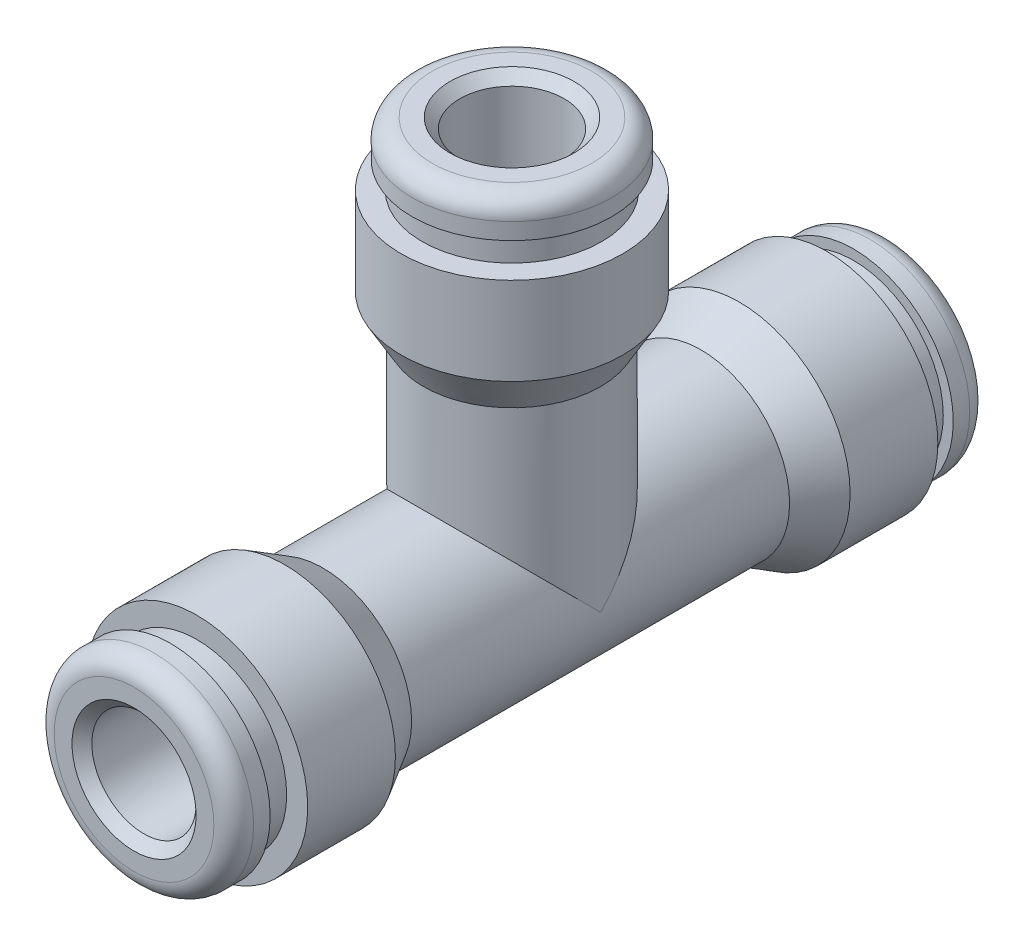
ISO-10303-21;
HEADER;
FILE_DESCRIPTION(('STEP AP214'),'2;1');
FILE_NAME('part.step','',(''),(''),'','','');
FILE_SCHEMA(('AUTOMOTIVE_DESIGN { 1 0 10303 214 1 1 1 1 }'));
ENDSEC;
DATA;
#1=APPLICATION_CONTEXT('core data for automotive mechanical design processes');
#2=APPLICATION_PROTOCOL_DEFINITION('international standard','automotive_design',2000,#1);
#3=PRODUCT_CONTEXT('',#1,'mechanical');
#4=PRODUCT('Part','Part','',(#3));
#5=PRODUCT_RELATED_PRODUCT_CATEGORY('part','',(#4));
#6=PRODUCT_DEFINITION_FORMATION('','',#4);
#7=PRODUCT_DEFINITION_CONTEXT('part definition',#1,'design');
#8=PRODUCT_DEFINITION('design','',#6,#7);
#9=PRODUCT_DEFINITION_SHAPE('','',#8);
#10=(LENGTH_UNIT() NAMED_UNIT(*) SI_UNIT(.MILLI.,.METRE.));
#11=(NAMED_UNIT(*) PLANE_ANGLE_UNIT() SI_UNIT($,.RADIAN.));
#12=(NAMED_UNIT(*) SI_UNIT($,.STERADIAN.) SOLID_ANGLE_UNIT());
#13=UNCERTAINTY_MEASURE_WITH_UNIT(LENGTH_MEASURE(1.E-05),#10,'distance_accuracy_value','');
#14=(GEOMETRIC_REPRESENTATION_CONTEXT(3) GLOBAL_UNCERTAINTY_ASSIGNED_CONTEXT((#13)) GLOBAL_UNIT_ASSIGNED_CONTEXT((#10,
#11,#12)) REPRESENTATION_CONTEXT('',''));
#15=CARTESIAN_POINT('',(0.,0.,0.));
#16=DIRECTION('',(0.,0.,1.));
#17=DIRECTION('',(1.,0.,0.));
#18=AXIS2_PLACEMENT_3D('',#15,#16,#17);
#19=CARTESIAN_POINT('',(0.,0.,0.));
#20=DIRECTION('',(0.,-1.,0.));
#21=DIRECTION('',(0.,0.,-1.));
#22=AXIS2_PLACEMENT_3D('',#19,#20,#21);
#23=CYLINDRICAL_SURFACE('',#22,1.23799999999998);
#24=CARTESIAN_POINT('',(0.,4.6,0.));
#25=DIRECTION('',(0.,-1.,0.));
#26=DIRECTION('',(1.,0.,0.));
#27=AXIS2_PLACEMENT_3D('',#24,#25,#26);
#28=CIRCLE('',#27,1.238);
#29=CARTESIAN_POINT('',(1.238,4.6,0.));
#30=VERTEX_POINT('',#29);
#31=EDGE_CURVE('E141',#30,#30,#28,.T.);
#32=ORIENTED_EDGE('',*,*,#31,.F.);
#33=EDGE_LOOP('',(#32));
#34=FACE_BOUND('',#33,.T.);
#35=CARTESIAN_POINT('',(0.,0.,0.));
#36=DIRECTION('',(0.,-0.707106781186547,0.707106781186547));
#37=DIRECTION('',(0.,-0.707106781186547,-0.707106781186547));
#38=AXIS2_PLACEMENT_3D('',#35,#36,#37);
#39=ELLIPSE('',#38,1.75079639021788,1.23799999999999);
#40=CARTESIAN_POINT('',(-1.238,0.,0.));
#41=VERTEX_POINT('',#40);
#42=CARTESIAN_POINT('',(1.238,0.,0.));
#43=VERTEX_POINT('',#42);
#44=EDGE_CURVE('E61',#41,#43,#39,.F.);
#45=ORIENTED_EDGE('',*,*,#44,.F.);
#46=CARTESIAN_POINT('',(0.,0.,0.));
#47=DIRECTION('',(0.,-0.707106781186547,-0.707106781186547));
#48=DIRECTION('',(0.,-0.707106781186547,0.707106781186547));
#49=AXIS2_PLACEMENT_3D('',#46,#47,#48);
#50=ELLIPSE('',#49,1.75079639021788,1.23799999999999);
#51=EDGE_CURVE('E65',#43,#41,#50,.F.);
#52=ORIENTED_EDGE('',*,*,#51,.F.);
#53=EDGE_LOOP('',(#45,#52));
#54=FACE_BOUND('',#53,.T.);
#55=ADVANCED_FACE('F38',(#34,#54),#23,.F.);
#56=CARTESIAN_POINT('',(0.,0.,0.));
#57=DIRECTION('',(0.,0.,1.));
#58=DIRECTION('',(1.,0.,0.));
#59=AXIS2_PLACEMENT_3D('',#56,#57,#58);
#60=CYLINDRICAL_SURFACE('',#59,1.238);
#61=ORIENTED_EDGE('',*,*,#44,.T.);
#62=ORIENTED_EDGE('',*,*,#51,.T.);
#63=EDGE_LOOP('',(#61,#62));
#64=FACE_BOUND('',#63,.T.);
#65=CARTESIAN_POINT('',(0.,0.,4.35));
#66=DIRECTION('',(0.,0.,-1.));
#67=DIRECTION('',(1.,0.,0.));
#68=AXIS2_PLACEMENT_3D('',#65,#66,#67);
#69=CIRCLE('',#68,1.238);
#70=CARTESIAN_POINT('',(1.238,0.,4.35));
#71=VERTEX_POINT('',#70);
#72=EDGE_CURVE('E103',#71,#71,#69,.T.);
#73=ORIENTED_EDGE('',*,*,#72,.F.);
#74=EDGE_LOOP('',(#73));
#75=FACE_BOUND('',#74,.T.);
#76=CARTESIAN_POINT('',(0.,0.,-4.35));
#77=DIRECTION('',(0.,0.,1.));
#78=DIRECTION('',(1.,0.,0.));
#79=AXIS2_PLACEMENT_3D('',#76,#77,#78);
#80=CIRCLE('',#79,1.238);
#81=CARTESIAN_POINT('',(1.238,0.,-4.35));
#82=VERTEX_POINT('',#81);
#83=EDGE_CURVE('E46',#82,#82,#80,.T.);
#84=ORIENTED_EDGE('',*,*,#83,.F.);
#85=EDGE_LOOP('',(#84));
#86=FACE_BOUND('',#85,.T.);
#87=ADVANCED_FACE('F63',(#64,#75,#86),#60,.F.);
#88=CARTESIAN_POINT('',(0.,0.,0.));
#89=DIRECTION('',(0.,0.,1.));
#90=DIRECTION('',(1.,0.,0.));
#91=AXIS2_PLACEMENT_3D('',#88,#89,#90);
#92=CYLINDRICAL_SURFACE('',#91,3.4);
#93=CARTESIAN_POINT('',(0.,0.,-7.25));
#94=DIRECTION('',(0.,0.,1.));
#95=DIRECTION('',(1.,0.,0.));
#96=AXIS2_PLACEMENT_3D('',#93,#94,#95);
#97=CIRCLE('',#96,3.4);
#98=CARTESIAN_POINT('',(3.4,0.,-7.25));
#99=VERTEX_POINT('',#98);
#100=EDGE_CURVE('E174',#99,#99,#97,.T.);
#101=ORIENTED_EDGE('',*,*,#100,.T.);
#102=EDGE_LOOP('',(#101));
#103=FACE_BOUND('',#102,.T.);
#104=CARTESIAN_POINT('',(0.,0.,0.));
#105=DIRECTION('',(0.,0.707106781186546,0.707106781186549));
#106=DIRECTION('',(0.,-0.707106781186549,0.707106781186546));
#107=AXIS2_PLACEMENT_3D('',#104,#105,#106);
#108=ELLIPSE('',#107,4.80832611206851,3.4);
#109=CARTESIAN_POINT('',(3.4,0.,0.));
#110=VERTEX_POINT('',#109);
#111=CARTESIAN_POINT('',(-3.4,0.,0.));
#112=VERTEX_POINT('',#111);
#113=EDGE_CURVE('E11',#110,#112,#108,.T.);
#114=ORIENTED_EDGE('',*,*,#113,.F.);
#115=CARTESIAN_POINT('',(0.,0.,0.));
#116=DIRECTION('',(0.,-0.707106781186551,0.707106781186544));
#117=DIRECTION('',(0.,-0.707106781186544,-0.707106781186551));
#118=AXIS2_PLACEMENT_3D('',#115,#116,#117);
#119=ELLIPSE('',#118,4.80832611206851,3.4);
#120=EDGE_CURVE('E106',#110,#112,#119,.T.);
#121=ORIENTED_EDGE('',*,*,#120,.T.);
#122=EDGE_LOOP('',(#114,#121));
#123=FACE_BOUND('',#122,.T.);
#124=CARTESIAN_POINT('',(0.,0.,7.25));
#125=DIRECTION('',(0.,0.,-1.));
#126=DIRECTION('',(1.,0.,0.));
#127=AXIS2_PLACEMENT_3D('',#124,#125,#126);
#128=CIRCLE('',#127,3.4);
#129=CARTESIAN_POINT('',(3.4,0.,7.25));
#130=VERTEX_POINT('',#129);
#131=EDGE_CURVE('E100',#130,#130,#128,.T.);
#132=ORIENTED_EDGE('',*,*,#131,.T.);
#133=EDGE_LOOP('',(#132));
#134=FACE_BOUND('',#133,.T.);
#135=ADVANCED_FACE('F181',(#103,#123,#134),#92,.T.);
#136=CARTESIAN_POINT('',(0.,2.,-4.35));
#137=DIRECTION('',(0.,0.,1.));
#138=DIRECTION('',(1.,0.,0.));
#139=AXIS2_PLACEMENT_3D('',#136,#137,#138);
#140=PLANE('',#139);
#141=CARTESIAN_POINT('',(0.,0.,-4.35));
#142=DIRECTION('',(0.,0.,1.));
#143=DIRECTION('',(1.,0.,0.));
#144=AXIS2_PLACEMENT_3D('',#141,#142,#143);
#145=CIRCLE('',#144,2.);
#146=CARTESIAN_POINT('',(2.,0.,-4.35));
#147=VERTEX_POINT('',#146);
#148=EDGE_CURVE('E144',#147,#147,#145,.T.);
#149=ORIENTED_EDGE('',*,*,#148,.F.);
#150=EDGE_LOOP('',(#149));
#151=FACE_BOUND('',#150,.T.);
#152=ORIENTED_EDGE('',*,*,#83,.T.);
#153=EDGE_LOOP('',(#152));
#154=FACE_BOUND('',#153,.T.);
#155=ADVANCED_FACE('F40',(#151,#154),#140,.F.);
#156=CARTESIAN_POINT('',(0.,0.,-8.72224318643354));
#157=DIRECTION('',(0.,0.,-1.));
#158=DIRECTION('',(-1.,0.,0.));
#159=AXIS2_PLACEMENT_3D('',#156,#157,#158);
#160=CONICAL_SURFACE('',#159,4.25,0.523598775598301);
#161=ORIENTED_EDGE('',*,*,#100,.F.);
#162=EDGE_LOOP('',(#161));
#163=FACE_BOUND('',#162,.T.);
#164=CARTESIAN_POINT('',(0.,0.,-8.72224318643354));
#165=DIRECTION('',(0.,0.,1.));
#166=DIRECTION('',(1.,0.,0.));
#167=AXIS2_PLACEMENT_3D('',#164,#165,#166);
#168=CIRCLE('',#167,4.25);
#169=CARTESIAN_POINT('',(4.25,0.,-8.72224318643354));
#170=VERTEX_POINT('',#169);
#171=EDGE_CURVE('E171',#170,#170,#168,.T.);
#172=ORIENTED_EDGE('',*,*,#171,.T.);
#173=EDGE_LOOP('',(#172));
#174=FACE_BOUND('',#173,.T.);
#175=ADVANCED_FACE('F191',(#163,#174),#160,.T.);
#176=CARTESIAN_POINT('',(0.,0.,0.));
#177=DIRECTION('',(0.,0.,1.));
#178=DIRECTION('',(1.,0.,0.));
#179=AXIS2_PLACEMENT_3D('',#176,#177,#178);
#180=CYLINDRICAL_SURFACE('',#179,4.25);
#181=ORIENTED_EDGE('',*,*,#171,.F.);
#182=EDGE_LOOP('',(#181));
#183=FACE_BOUND('',#182,.T.);
#184=CARTESIAN_POINT('',(0.,0.,-12.087));
#185=DIRECTION('',(0.,0.,1.));
#186=DIRECTION('',(1.,0.,0.));
#187=AXIS2_PLACEMENT_3D('',#184,#185,#186);
#188=CIRCLE('',#187,4.25);
#189=CARTESIAN_POINT('',(4.25,0.,-12.087));
#190=VERTEX_POINT('',#189);
#191=EDGE_CURVE('E168',#190,#190,#188,.T.);
#192=ORIENTED_EDGE('',*,*,#191,.T.);
#193=EDGE_LOOP('',(#192));
#194=FACE_BOUND('',#193,.T.);
#195=ADVANCED_FACE('F194',(#183,#194),#180,.T.);
#196=CARTESIAN_POINT('',(0.,4.25,-12.087));
#197=DIRECTION('',(0.,0.,1.));
#198=DIRECTION('',(1.,0.,0.));
#199=AXIS2_PLACEMENT_3D('',#196,#197,#198);
#200=PLANE('',#199);
#201=ORIENTED_EDGE('',*,*,#191,.F.);
#202=EDGE_LOOP('',(#201));
#203=FACE_BOUND('',#202,.T.);
#204=CARTESIAN_POINT('',(0.,0.,-12.087));
#205=DIRECTION('',(0.,0.,1.));
#206=DIRECTION('',(1.,0.,0.));
#207=AXIS2_PLACEMENT_3D('',#204,#205,#206);
#208=CIRCLE('',#207,3.4425);
#209=CARTESIAN_POINT('',(3.4425,0.,-12.087));
#210=VERTEX_POINT('',#209);
#211=EDGE_CURVE('E165',#210,#210,#208,.T.);
#212=ORIENTED_EDGE('',*,*,#211,.T.);
#213=EDGE_LOOP('',(#212));
#214=FACE_BOUND('',#213,.T.);
#215=ADVANCED_FACE('F198',(#203,#214),#200,.F.);
#216=CARTESIAN_POINT('',(0.,0.,0.));
#217=DIRECTION('',(0.,0.,1.));
#218=DIRECTION('',(1.,0.,0.));
#219=AXIS2_PLACEMENT_3D('',#216,#217,#218);
#220=CYLINDRICAL_SURFACE('',#219,3.4425);
#221=ORIENTED_EDGE('',*,*,#211,.F.);
#222=EDGE_LOOP('',(#221));
#223=FACE_BOUND('',#222,.T.);
#224=CARTESIAN_POINT('',(0.,0.,-13.103));
#225=DIRECTION('',(0.,0.,1.));
#226=DIRECTION('',(1.,0.,0.));
#227=AXIS2_PLACEMENT_3D('',#224,#225,#226);
#228=CIRCLE('',#227,3.4425);
#229=CARTESIAN_POINT('',(3.4425,0.,-13.103));
#230=VERTEX_POINT('',#229);
#231=EDGE_CURVE('E162',#230,#230,#228,.T.);
#232=ORIENTED_EDGE('',*,*,#231,.T.);
#233=EDGE_LOOP('',(#232));
#234=FACE_BOUND('',#233,.T.);
#235=ADVANCED_FACE('F202',(#223,#234),#220,.T.);
#236=CARTESIAN_POINT('',(0.,3.825,-13.103));
#237=DIRECTION('',(0.,0.,-1.));
#238=DIRECTION('',(-1.,0.,0.));
#239=AXIS2_PLACEMENT_3D('',#236,#237,#238);
#240=PLANE('',#239);
#241=ORIENTED_EDGE('',*,*,#231,.F.);
#242=EDGE_LOOP('',(#241));
#243=FACE_BOUND('',#242,.T.);
#244=CARTESIAN_POINT('',(0.,0.,-13.103));
#245=DIRECTION('',(0.,0.,1.));
#246=DIRECTION('',(1.,0.,0.));
#247=AXIS2_PLACEMENT_3D('',#244,#245,#246);
#248=CIRCLE('',#247,3.825);
#249=CARTESIAN_POINT('',(3.825,0.,-13.103));
#250=VERTEX_POINT('',#249);
#251=EDGE_CURVE('E159',#250,#250,#248,.T.);
#252=ORIENTED_EDGE('',*,*,#251,.T.);
#253=EDGE_LOOP('',(#252));
#254=FACE_BOUND('',#253,.T.);
#255=ADVANCED_FACE('F206',(#243,#254),#240,.F.);
#256=CARTESIAN_POINT('',(0.,0.,0.));
#257=DIRECTION('',(0.,0.,1.));
#258=DIRECTION('',(1.,0.,0.));
#259=AXIS2_PLACEMENT_3D('',#256,#257,#258);
#260=CYLINDRICAL_SURFACE('',#259,3.825);
#261=ORIENTED_EDGE('',*,*,#251,.F.);
#262=EDGE_LOOP('',(#261));
#263=FACE_BOUND('',#262,.T.);
#264=CARTESIAN_POINT('',(0.,0.,-13.738));
#265=DIRECTION('',(0.,0.,1.));
#266=DIRECTION('',(1.,0.,0.));
#267=AXIS2_PLACEMENT_3D('',#264,#265,#266);
#268=CIRCLE('',#267,3.825);
#269=CARTESIAN_POINT('',(3.825,0.,-13.738));
#270=VERTEX_POINT('',#269);
#271=EDGE_CURVE('E156',#270,#270,#268,.T.);
#272=ORIENTED_EDGE('',*,*,#271,.T.);
#273=EDGE_LOOP('',(#272));
#274=FACE_BOUND('',#273,.T.);
#275=ADVANCED_FACE('F210',(#263,#274),#260,.T.);
#276=CARTESIAN_POINT('',(0.,0.,-13.738));
#277=DIRECTION('',(0.,0.,1.));
#278=DIRECTION('',(1.,0.,0.));
#279=AXIS2_PLACEMENT_3D('',#276,#277,#278);
#280=TOROIDAL_SURFACE('',#279,3.063,0.762000000000001);
#281=ORIENTED_EDGE('',*,*,#271,.F.);
#282=EDGE_LOOP('',(#281));
#283=FACE_BOUND('',#282,.T.);
#284=CARTESIAN_POINT('',(0.,0.,-14.5));
#285=DIRECTION('',(0.,0.,1.));
#286=DIRECTION('',(1.,0.,0.));
#287=AXIS2_PLACEMENT_3D('',#284,#285,#286);
#288=CIRCLE('',#287,3.063);
#289=CARTESIAN_POINT('',(3.063,0.,-14.5));
#290=VERTEX_POINT('',#289);
#291=EDGE_CURVE('E153',#290,#290,#288,.T.);
#292=ORIENTED_EDGE('',*,*,#291,.T.);
#293=EDGE_LOOP('',(#292));
#294=FACE_BOUND('',#293,.T.);
#295=ADVANCED_FACE('F214',(#283,#294),#280,.T.);
#296=CARTESIAN_POINT('',(0.,3.063,-14.5));
#297=DIRECTION('',(0.,0.,1.));
#298=DIRECTION('',(1.,0.,0.));
#299=AXIS2_PLACEMENT_3D('',#296,#297,#298);
#300=PLANE('',#299);
#301=ORIENTED_EDGE('',*,*,#291,.F.);
#302=EDGE_LOOP('',(#301));
#303=FACE_BOUND('',#302,.T.);
#304=CARTESIAN_POINT('',(0.,0.,-14.5));
#305=DIRECTION('',(0.,0.,1.));
#306=DIRECTION('',(1.,0.,0.));
#307=AXIS2_PLACEMENT_3D('',#304,#305,#306);
#308=CIRCLE('',#307,2.381);
#309=CARTESIAN_POINT('',(2.381,0.,-14.5));
#310=VERTEX_POINT('',#309);
#311=EDGE_CURVE('E150',#310,#310,#308,.T.);
#312=ORIENTED_EDGE('',*,*,#311,.T.);
#313=EDGE_LOOP('',(#312));
#314=FACE_BOUND('',#313,.T.);
#315=ADVANCED_FACE('F218',(#303,#314),#300,.F.);
#316=CARTESIAN_POINT('',(0.,0.,-14.119));
#317=DIRECTION('',(0.,0.,-1.));
#318=DIRECTION('',(-1.,0.,0.));
#319=AXIS2_PLACEMENT_3D('',#316,#317,#318);
#320=CONICAL_SURFACE('',#319,2.,0.785398163397451);
#321=ORIENTED_EDGE('',*,*,#311,.F.);
#322=EDGE_LOOP('',(#321));
#323=FACE_BOUND('',#322,.T.);
#324=CARTESIAN_POINT('',(0.,0.,-14.119));
#325=DIRECTION('',(0.,0.,1.));
#326=DIRECTION('',(1.,0.,0.));
#327=AXIS2_PLACEMENT_3D('',#324,#325,#326);
#328=CIRCLE('',#327,2.);
#329=CARTESIAN_POINT('',(2.,0.,-14.119));
#330=VERTEX_POINT('',#329);
#331=EDGE_CURVE('E147',#330,#330,#328,.T.);
#332=ORIENTED_EDGE('',*,*,#331,.T.);
#333=EDGE_LOOP('',(#332));
#334=FACE_BOUND('',#333,.T.);
#335=ADVANCED_FACE('F222',(#323,#334),#320,.F.);
#336=CARTESIAN_POINT('',(0.,0.,0.));
#337=DIRECTION('',(0.,0.,1.));
#338=DIRECTION('',(1.,0.,0.));
#339=AXIS2_PLACEMENT_3D('',#336,#337,#338);
#340=CYLINDRICAL_SURFACE('',#339,2.);
#341=ORIENTED_EDGE('',*,*,#331,.F.);
#342=EDGE_LOOP('',(#341));
#343=FACE_BOUND('',#342,.T.);
#344=ORIENTED_EDGE('',*,*,#148,.T.);
#345=EDGE_LOOP('',(#344));
#346=FACE_BOUND('',#345,.T.);
#347=ADVANCED_FACE('F226',(#343,#346),#340,.F.);
#348=CARTESIAN_POINT('',(0.,0.,0.));
#349=DIRECTION('',(0.,0.,-1.));
#350=DIRECTION('',(1.,0.,0.));
#351=AXIS2_PLACEMENT_3D('',#348,#349,#350);
#352=CYLINDRICAL_SURFACE('',#351,2.);
#353=CARTESIAN_POINT('',(0.,0.,14.119));
#354=DIRECTION('',(0.,0.,-1.));
#355=DIRECTION('',(1.,0.,0.));
#356=AXIS2_PLACEMENT_3D('',#353,#354,#355);
#357=CIRCLE('',#356,2.);
#358=CARTESIAN_POINT('',(2.,0.,14.119));
#359=VERTEX_POINT('',#358);
#360=EDGE_CURVE('E71',#359,#359,#357,.T.);
#361=ORIENTED_EDGE('',*,*,#360,.F.);
#362=EDGE_LOOP('',(#361));
#363=FACE_BOUND('',#362,.T.);
#364=CARTESIAN_POINT('',(0.,0.,4.35));
#365=DIRECTION('',(0.,0.,-1.));
#366=DIRECTION('',(1.,0.,0.));
#367=AXIS2_PLACEMENT_3D('',#364,#365,#366);
#368=CIRCLE('',#367,2.);
#369=CARTESIAN_POINT('',(2.,0.,4.35));
#370=VERTEX_POINT('',#369);
#371=EDGE_CURVE('E68',#370,#370,#368,.T.);
#372=ORIENTED_EDGE('',*,*,#371,.T.);
#373=EDGE_LOOP('',(#372));
#374=FACE_BOUND('',#373,.T.);
#375=ADVANCED_FACE('F229',(#363,#374),#352,.F.);
#376=CARTESIAN_POINT('',(0.,0.,14.119));
#377=DIRECTION('',(0.,0.,1.));
#378=DIRECTION('',(-1.,0.,0.));
#379=AXIS2_PLACEMENT_3D('',#376,#377,#378);
#380=CONICAL_SURFACE('',#379,2.,0.785398163397451);
#381=CARTESIAN_POINT('',(0.,-1.01252958826451E-13,14.5));
#382=DIRECTION('',(0.,0.,-1.));
#383=DIRECTION('',(1.,0.,0.));
#384=AXIS2_PLACEMENT_3D('',#381,#382,#383);
#385=CIRCLE('',#384,2.381);
#386=CARTESIAN_POINT('',(2.381,-1.01252958826451E-13,14.5));
#387=VERTEX_POINT('',#386);
#388=EDGE_CURVE('E76',#387,#387,#385,.T.);
#389=ORIENTED_EDGE('',*,*,#388,.F.);
#390=EDGE_LOOP('',(#389));
#391=FACE_BOUND('',#390,.T.);
#392=ORIENTED_EDGE('',*,*,#360,.T.);
#393=EDGE_LOOP('',(#392));
#394=FACE_BOUND('',#393,.T.);
#395=ADVANCED_FACE('F315',(#391,#394),#380,.F.);
#396=CARTESIAN_POINT('',(0.,-3.0630000000001,14.5));
#397=DIRECTION('',(0.,0.,-1.));
#398=DIRECTION('',(1.,0.,0.));
#399=AXIS2_PLACEMENT_3D('',#396,#397,#398);
#400=PLANE('',#399);
#401=CARTESIAN_POINT('',(0.,-1.01252958826451E-13,14.5));
#402=DIRECTION('',(0.,0.,-1.));
#403=DIRECTION('',(1.,0.,0.));
#404=AXIS2_PLACEMENT_3D('',#401,#402,#403);
#405=CIRCLE('',#404,3.063);
#406=CARTESIAN_POINT('',(3.063,-1.01252958826451E-13,14.5));
#407=VERTEX_POINT('',#406);
#408=EDGE_CURVE('E79',#407,#407,#405,.T.);
#409=ORIENTED_EDGE('',*,*,#408,.F.);
#410=EDGE_LOOP('',(#409));
#411=FACE_BOUND('',#410,.T.);
#412=ORIENTED_EDGE('',*,*,#388,.T.);
#413=EDGE_LOOP('',(#412));
#414=FACE_BOUND('',#413,.T.);
#415=ADVANCED_FACE('F311',(#411,#414),#400,.F.);
#416=CARTESIAN_POINT('',(0.,0.,13.738));
#417=DIRECTION('',(0.,0.,-1.));
#418=DIRECTION('',(1.,0.,0.));
#419=AXIS2_PLACEMENT_3D('',#416,#417,#418);
#420=TOROIDAL_SURFACE('',#419,3.063,0.762000000000001);
#421=CARTESIAN_POINT('',(0.,0.,13.738));
#422=DIRECTION('',(0.,0.,-1.));
#423=DIRECTION('',(1.,0.,0.));
#424=AXIS2_PLACEMENT_3D('',#421,#422,#423);
#425=CIRCLE('',#424,3.825);
#426=CARTESIAN_POINT('',(3.825,0.,13.738));
#427=VERTEX_POINT('',#426);
#428=EDGE_CURVE('E82',#427,#427,#425,.T.);
#429=ORIENTED_EDGE('',*,*,#428,.F.);
#430=EDGE_LOOP('',(#429));
#431=FACE_BOUND('',#430,.T.);
#432=ORIENTED_EDGE('',*,*,#408,.T.);
#433=EDGE_LOOP('',(#432));
#434=FACE_BOUND('',#433,.T.);
#435=ADVANCED_FACE('F307',(#431,#434),#420,.T.);
#436=CARTESIAN_POINT('',(0.,0.,0.));
#437=DIRECTION('',(0.,0.,-1.));
#438=DIRECTION('',(1.,0.,0.));
#439=AXIS2_PLACEMENT_3D('',#436,#437,#438);
#440=CYLINDRICAL_SURFACE('',#439,3.825);
#441=CARTESIAN_POINT('',(0.,0.,13.103));
#442=DIRECTION('',(0.,0.,-1.));
#443=DIRECTION('',(1.,0.,0.));
#444=AXIS2_PLACEMENT_3D('',#441,#442,#443);
#445=CIRCLE('',#444,3.825);
#446=CARTESIAN_POINT('',(3.825,0.,13.103));
#447=VERTEX_POINT('',#446);
#448=EDGE_CURVE('E85',#447,#447,#445,.T.);
#449=ORIENTED_EDGE('',*,*,#448,.F.);
#450=EDGE_LOOP('',(#449));
#451=FACE_BOUND('',#450,.T.);
#452=ORIENTED_EDGE('',*,*,#428,.T.);
#453=EDGE_LOOP('',(#452));
#454=FACE_BOUND('',#453,.T.);
#455=ADVANCED_FACE('F303',(#451,#454),#440,.T.);
#456=CARTESIAN_POINT('',(0.,-3.82500000000009,13.103));
#457=DIRECTION('',(0.,0.,1.));
#458=DIRECTION('',(-1.,0.,0.));
#459=AXIS2_PLACEMENT_3D('',#456,#457,#458);
#460=PLANE('',#459);
#461=CARTESIAN_POINT('',(0.,0.,13.103));
#462=DIRECTION('',(0.,0.,-1.));
#463=DIRECTION('',(1.,0.,0.));
#464=AXIS2_PLACEMENT_3D('',#461,#462,#463);
#465=CIRCLE('',#464,3.4425);
#466=CARTESIAN_POINT('',(3.4425,0.,13.103));
#467=VERTEX_POINT('',#466);
#468=EDGE_CURVE('E88',#467,#467,#465,.T.);
#469=ORIENTED_EDGE('',*,*,#468,.F.);
#470=EDGE_LOOP('',(#469));
#471=FACE_BOUND('',#470,.T.);
#472=ORIENTED_EDGE('',*,*,#448,.T.);
#473=EDGE_LOOP('',(#472));
#474=FACE_BOUND('',#473,.T.);
#475=ADVANCED_FACE('F299',(#471,#474),#460,.F.);
#476=CARTESIAN_POINT('',(0.,0.,0.));
#477=DIRECTION('',(0.,0.,-1.));
#478=DIRECTION('',(1.,0.,0.));
#479=AXIS2_PLACEMENT_3D('',#476,#477,#478);
#480=CYLINDRICAL_SURFACE('',#479,3.4425);
#481=CARTESIAN_POINT('',(0.,0.,12.087));
#482=DIRECTION('',(0.,0.,-1.));
#483=DIRECTION('',(1.,0.,0.));
#484=AXIS2_PLACEMENT_3D('',#481,#482,#483);
#485=CIRCLE('',#484,3.4425);
#486=CARTESIAN_POINT('',(3.4425,0.,12.087));
#487=VERTEX_POINT('',#486);
#488=EDGE_CURVE('E91',#487,#487,#485,.T.);
#489=ORIENTED_EDGE('',*,*,#488,.F.);
#490=EDGE_LOOP('',(#489));
#491=FACE_BOUND('',#490,.T.);
#492=ORIENTED_EDGE('',*,*,#468,.T.);
#493=EDGE_LOOP('',(#492));
#494=FACE_BOUND('',#493,.T.);
#495=ADVANCED_FACE('F295',(#491,#494),#480,.T.);
#496=CARTESIAN_POINT('',(0.,-4.25000000000008,12.087));
#497=DIRECTION('',(0.,0.,-1.));
#498=DIRECTION('',(1.,0.,0.));
#499=AXIS2_PLACEMENT_3D('',#496,#497,#498);
#500=PLANE('',#499);
#501=CARTESIAN_POINT('',(0.,0.,12.087));
#502=DIRECTION('',(0.,0.,-1.));
#503=DIRECTION('',(1.,0.,0.));
#504=AXIS2_PLACEMENT_3D('',#501,#502,#503);
#505=CIRCLE('',#504,4.25);
#506=CARTESIAN_POINT('',(4.25,0.,12.087));
#507=VERTEX_POINT('',#506);
#508=EDGE_CURVE('E94',#507,#507,#505,.T.);
#509=ORIENTED_EDGE('',*,*,#508,.F.);
#510=EDGE_LOOP('',(#509));
#511=FACE_BOUND('',#510,.T.);
#512=ORIENTED_EDGE('',*,*,#488,.T.);
#513=EDGE_LOOP('',(#512));
#514=FACE_BOUND('',#513,.T.);
#515=ADVANCED_FACE('F291',(#511,#514),#500,.F.);
#516=CARTESIAN_POINT('',(0.,0.,0.));
#517=DIRECTION('',(0.,0.,-1.));
#518=DIRECTION('',(1.,0.,0.));
#519=AXIS2_PLACEMENT_3D('',#516,#517,#518);
#520=CYLINDRICAL_SURFACE('',#519,4.25);
#521=CARTESIAN_POINT('',(0.,0.,8.72224318643354));
#522=DIRECTION('',(0.,0.,-1.));
#523=DIRECTION('',(1.,0.,0.));
#524=AXIS2_PLACEMENT_3D('',#521,#522,#523);
#525=CIRCLE('',#524,4.25);
#526=CARTESIAN_POINT('',(4.25,0.,8.72224318643354));
#527=VERTEX_POINT('',#526);
#528=EDGE_CURVE('E97',#527,#527,#525,.T.);
#529=ORIENTED_EDGE('',*,*,#528,.F.);
#530=EDGE_LOOP('',(#529));
#531=FACE_BOUND('',#530,.T.);
#532=ORIENTED_EDGE('',*,*,#508,.T.);
#533=EDGE_LOOP('',(#532));
#534=FACE_BOUND('',#533,.T.);
#535=ADVANCED_FACE('F287',(#531,#534),#520,.T.);
#536=CARTESIAN_POINT('',(0.,0.,8.72224318643354));
#537=DIRECTION('',(0.,0.,1.));
#538=DIRECTION('',(-1.,0.,0.));
#539=AXIS2_PLACEMENT_3D('',#536,#537,#538);
#540=CONICAL_SURFACE('',#539,4.25,0.523598775598301);
#541=ORIENTED_EDGE('',*,*,#131,.F.);
#542=EDGE_LOOP('',(#541));
#543=FACE_BOUND('',#542,.T.);
#544=ORIENTED_EDGE('',*,*,#528,.T.);
#545=EDGE_LOOP('',(#544));
#546=FACE_BOUND('',#545,.T.);
#547=ADVANCED_FACE('F283',(#543,#546),#540,.T.);
#548=CARTESIAN_POINT('',(0.,-2.00000000000003,4.34999999999999));
#549=DIRECTION('',(0.,0.,-1.));
#550=DIRECTION('',(1.,0.,0.));
#551=AXIS2_PLACEMENT_3D('',#548,#549,#550);
#552=PLANE('',#551);
#553=ORIENTED_EDGE('',*,*,#371,.F.);
#554=EDGE_LOOP('',(#553));
#555=FACE_BOUND('',#554,.T.);
#556=ORIENTED_EDGE('',*,*,#72,.T.);
#557=EDGE_LOOP('',(#556));
#558=FACE_BOUND('',#557,.T.);
#559=ADVANCED_FACE('F279',(#555,#558),#552,.F.);
#560=CARTESIAN_POINT('',(0.,0.249999999999999,0.));
#561=DIRECTION('',(0.,-1.,0.));
#562=DIRECTION('',(1.,0.,0.));
#563=AXIS2_PLACEMENT_3D('',#560,#561,#562);
#564=CYLINDRICAL_SURFACE('',#563,2.);
#565=CARTESIAN_POINT('',(0.,14.369,0.));
#566=DIRECTION('',(0.,-1.,0.));
#567=DIRECTION('',(1.,0.,0.));
#568=AXIS2_PLACEMENT_3D('',#565,#566,#567);
#569=CIRCLE('',#568,2.);
#570=CARTESIAN_POINT('',(2.,14.369,0.));
#571=VERTEX_POINT('',#570);
#572=EDGE_CURVE('E111',#571,#571,#569,.T.);
#573=ORIENTED_EDGE('',*,*,#572,.F.);
#574=EDGE_LOOP('',(#573));
#575=FACE_BOUND('',#574,.T.);
#576=CARTESIAN_POINT('',(0.,4.6,0.));
#577=DIRECTION('',(0.,-1.,0.));
#578=DIRECTION('',(1.,0.,0.));
#579=AXIS2_PLACEMENT_3D('',#576,#577,#578);
#580=CIRCLE('',#579,2.);
#581=CARTESIAN_POINT('',(2.,4.6,0.));
#582=VERTEX_POINT('',#581);
#583=EDGE_CURVE('E108',#582,#582,#580,.T.);
#584=ORIENTED_EDGE('',*,*,#583,.T.);
#585=EDGE_LOOP('',(#584));
#586=FACE_BOUND('',#585,.T.);
#587=ADVANCED_FACE('F275',(#575,#586),#564,.F.);
#588=CARTESIAN_POINT('',(0.,14.369,0.));
#589=DIRECTION('',(0.,1.,0.));
#590=DIRECTION('',(-1.,0.,0.));
#591=AXIS2_PLACEMENT_3D('',#588,#589,#590);
#592=CONICAL_SURFACE('',#591,2.,0.785398163397451);
#593=CARTESIAN_POINT('',(0.,14.75,0.));
#594=DIRECTION('',(0.,-1.,0.));
#595=DIRECTION('',(1.,0.,0.));
#596=AXIS2_PLACEMENT_3D('',#593,#594,#595);
#597=CIRCLE('',#596,2.381);
#598=CARTESIAN_POINT('',(2.381,14.75,0.));
#599=VERTEX_POINT('',#598);
#600=EDGE_CURVE('E114',#599,#599,#597,.T.);
#601=ORIENTED_EDGE('',*,*,#600,.F.);
#602=EDGE_LOOP('',(#601));
#603=FACE_BOUND('',#602,.T.);
#604=ORIENTED_EDGE('',*,*,#572,.T.);
#605=EDGE_LOOP('',(#604));
#606=FACE_BOUND('',#605,.T.);
#607=ADVANCED_FACE('F271',(#603,#606),#592,.F.);
#608=CARTESIAN_POINT('',(0.,14.75,3.06300000000005));
#609=DIRECTION('',(0.,-1.,0.));
#610=DIRECTION('',(1.,0.,0.));
#611=AXIS2_PLACEMENT_3D('',#608,#609,#610);
#612=PLANE('',#611);
#613=CARTESIAN_POINT('',(0.,14.75,0.));
#614=DIRECTION('',(0.,-1.,0.));
#615=DIRECTION('',(1.,0.,0.));
#616=AXIS2_PLACEMENT_3D('',#613,#614,#615);
#617=CIRCLE('',#616,3.063);
#618=CARTESIAN_POINT('',(3.063,14.75,0.));
#619=VERTEX_POINT('',#618);
#620=EDGE_CURVE('E117',#619,#619,#617,.T.);
#621=ORIENTED_EDGE('',*,*,#620,.F.);
#622=EDGE_LOOP('',(#621));
#623=FACE_BOUND('',#622,.T.);
#624=ORIENTED_EDGE('',*,*,#600,.T.);
#625=EDGE_LOOP('',(#624));
#626=FACE_BOUND('',#625,.T.);
#627=ADVANCED_FACE('F267',(#623,#626),#612,.F.);
#628=CARTESIAN_POINT('',(0.,13.988,0.));
#629=DIRECTION('',(0.,-1.,0.));
#630=DIRECTION('',(1.,0.,0.));
#631=AXIS2_PLACEMENT_3D('',#628,#629,#630);
#632=TOROIDAL_SURFACE('',#631,3.063,0.762000000000001);
#633=CARTESIAN_POINT('',(0.,13.988,0.));
#634=DIRECTION('',(0.,-1.,0.));
#635=DIRECTION('',(1.,0.,0.));
#636=AXIS2_PLACEMENT_3D('',#633,#634,#635);
#637=CIRCLE('',#636,3.825);
#638=CARTESIAN_POINT('',(3.825,13.988,0.));
#639=VERTEX_POINT('',#638);
#640=EDGE_CURVE('E120',#639,#639,#637,.T.);
#641=ORIENTED_EDGE('',*,*,#640,.F.);
#642=EDGE_LOOP('',(#641));
#643=FACE_BOUND('',#642,.T.);
#644=ORIENTED_EDGE('',*,*,#620,.T.);
#645=EDGE_LOOP('',(#644));
#646=FACE_BOUND('',#645,.T.);
#647=ADVANCED_FACE('F263',(#643,#646),#632,.T.);
#648=CARTESIAN_POINT('',(0.,0.249999999999999,0.));
#649=DIRECTION('',(0.,-1.,0.));
#650=DIRECTION('',(1.,0.,0.));
#651=AXIS2_PLACEMENT_3D('',#648,#649,#650);
#652=CYLINDRICAL_SURFACE('',#651,3.825);
#653=CARTESIAN_POINT('',(0.,13.353,0.));
#654=DIRECTION('',(0.,-1.,0.));
#655=DIRECTION('',(1.,0.,0.));
#656=AXIS2_PLACEMENT_3D('',#653,#654,#655);
#657=CIRCLE('',#656,3.825);
#658=CARTESIAN_POINT('',(3.825,13.353,0.));
#659=VERTEX_POINT('',#658);
#660=EDGE_CURVE('E123',#659,#659,#657,.T.);
#661=ORIENTED_EDGE('',*,*,#660,.F.);
#662=EDGE_LOOP('',(#661));
#663=FACE_BOUND('',#662,.T.);
#664=ORIENTED_EDGE('',*,*,#640,.T.);
#665=EDGE_LOOP('',(#664));
#666=FACE_BOUND('',#665,.T.);
#667=ADVANCED_FACE('F259',(#663,#666),#652,.T.);
#668=CARTESIAN_POINT('',(0.,13.353,3.82500000000005));
#669=DIRECTION('',(0.,1.,0.));
#670=DIRECTION('',(-1.,0.,0.));
#671=AXIS2_PLACEMENT_3D('',#668,#669,#670);
#672=PLANE('',#671);
#673=CARTESIAN_POINT('',(0.,13.353,0.));
#674=DIRECTION('',(0.,-1.,0.));
#675=DIRECTION('',(1.,0.,0.));
#676=AXIS2_PLACEMENT_3D('',#673,#674,#675);
#677=CIRCLE('',#676,3.4425);
#678=CARTESIAN_POINT('',(3.4425,13.353,0.));
#679=VERTEX_POINT('',#678);
#680=EDGE_CURVE('E126',#679,#679,#677,.T.);
#681=ORIENTED_EDGE('',*,*,#680,.F.);
#682=EDGE_LOOP('',(#681));
#683=FACE_BOUND('',#682,.T.);
#684=ORIENTED_EDGE('',*,*,#660,.T.);
#685=EDGE_LOOP('',(#684));
#686=FACE_BOUND('',#685,.T.);
#687=ADVANCED_FACE('F255',(#683,#686),#672,.F.);
#688=CARTESIAN_POINT('',(0.,0.249999999999999,0.));
#689=DIRECTION('',(0.,-1.,0.));
#690=DIRECTION('',(1.,0.,0.));
#691=AXIS2_PLACEMENT_3D('',#688,#689,#690);
#692=CYLINDRICAL_SURFACE('',#691,3.4425);
#693=CARTESIAN_POINT('',(0.,12.337,0.));
#694=DIRECTION('',(0.,-1.,0.));
#695=DIRECTION('',(1.,0.,0.));
#696=AXIS2_PLACEMENT_3D('',#693,#694,#695);
#697=CIRCLE('',#696,3.4425);
#698=CARTESIAN_POINT('',(3.4425,12.337,0.));
#699=VERTEX_POINT('',#698);
#700=EDGE_CURVE('E129',#699,#699,#697,.T.);
#701=ORIENTED_EDGE('',*,*,#700,.F.);
#702=EDGE_LOOP('',(#701));
#703=FACE_BOUND('',#702,.T.);
#704=ORIENTED_EDGE('',*,*,#680,.T.);
#705=EDGE_LOOP('',(#704));
#706=FACE_BOUND('',#705,.T.);
#707=ADVANCED_FACE('F251',(#703,#706),#692,.T.);
#708=CARTESIAN_POINT('',(0.,12.337,4.25000000000004));
#709=DIRECTION('',(0.,-1.,0.));
#710=DIRECTION('',(1.,0.,0.));
#711=AXIS2_PLACEMENT_3D('',#708,#709,#710);
#712=PLANE('',#711);
#713=CARTESIAN_POINT('',(0.,12.337,0.));
#714=DIRECTION('',(0.,-1.,0.));
#715=DIRECTION('',(1.,0.,0.));
#716=AXIS2_PLACEMENT_3D('',#713,#714,#715);
#717=CIRCLE('',#716,4.25);
#718=CARTESIAN_POINT('',(4.25,12.337,0.));
#719=VERTEX_POINT('',#718);
#720=EDGE_CURVE('E132',#719,#719,#717,.T.);
#721=ORIENTED_EDGE('',*,*,#720,.F.);
#722=EDGE_LOOP('',(#721));
#723=FACE_BOUND('',#722,.T.);
#724=ORIENTED_EDGE('',*,*,#700,.T.);
#725=EDGE_LOOP('',(#724));
#726=FACE_BOUND('',#725,.T.);
#727=ADVANCED_FACE('F247',(#723,#726),#712,.F.);
#728=CARTESIAN_POINT('',(0.,0.249999999999999,0.));
#729=DIRECTION('',(0.,-1.,0.));
#730=DIRECTION('',(1.,0.,0.));
#731=AXIS2_PLACEMENT_3D('',#728,#729,#730);
#732=CYLINDRICAL_SURFACE('',#731,4.25);
#733=CARTESIAN_POINT('',(0.,8.97224318643354,0.));
#734=DIRECTION('',(0.,-1.,0.));
#735=DIRECTION('',(1.,0.,0.));
#736=AXIS2_PLACEMENT_3D('',#733,#734,#735);
#737=CIRCLE('',#736,4.25);
#738=CARTESIAN_POINT('',(4.25,8.97224318643354,0.));
#739=VERTEX_POINT('',#738);
#740=EDGE_CURVE('E135',#739,#739,#737,.T.);
#741=ORIENTED_EDGE('',*,*,#740,.F.);
#742=EDGE_LOOP('',(#741));
#743=FACE_BOUND('',#742,.T.);
#744=ORIENTED_EDGE('',*,*,#720,.T.);
#745=EDGE_LOOP('',(#744));
#746=FACE_BOUND('',#745,.T.);
#747=ADVANCED_FACE('F243',(#743,#746),#732,.T.);
#748=CARTESIAN_POINT('',(0.,8.97224318643354,0.));
#749=DIRECTION('',(0.,1.,0.));
#750=DIRECTION('',(-1.,0.,0.));
#751=AXIS2_PLACEMENT_3D('',#748,#749,#750);
#752=CONICAL_SURFACE('',#751,4.25,0.523598775598301);
#753=CARTESIAN_POINT('',(0.,7.5,0.));
#754=DIRECTION('',(0.,-1.,0.));
#755=DIRECTION('',(1.,0.,0.));
#756=AXIS2_PLACEMENT_3D('',#753,#754,#755);
#757=CIRCLE('',#756,3.4);
#758=CARTESIAN_POINT('',(3.4,7.5,0.));
#759=VERTEX_POINT('',#758);
#760=EDGE_CURVE('E138',#759,#759,#757,.T.);
#761=ORIENTED_EDGE('',*,*,#760,.F.);
#762=EDGE_LOOP('',(#761));
#763=FACE_BOUND('',#762,.T.);
#764=ORIENTED_EDGE('',*,*,#740,.T.);
#765=EDGE_LOOP('',(#764));
#766=FACE_BOUND('',#765,.T.);
#767=ADVANCED_FACE('F236',(#763,#766),#752,.T.);
#768=CARTESIAN_POINT('',(0.,4.59999999999999,2.00000000000002));
#769=DIRECTION('',(0.,-1.,0.));
#770=DIRECTION('',(1.,0.,0.));
#771=AXIS2_PLACEMENT_3D('',#768,#769,#770);
#772=PLANE('',#771);
#773=ORIENTED_EDGE('',*,*,#583,.F.);
#774=EDGE_LOOP('',(#773));
#775=FACE_BOUND('',#774,.T.);
#776=ORIENTED_EDGE('',*,*,#31,.T.);
#777=EDGE_LOOP('',(#776));
#778=FACE_BOUND('',#777,.T.);
#779=ADVANCED_FACE('F232',(#775,#778),#772,.F.);
#780=CARTESIAN_POINT('',(0.,0.249999999999999,0.));
#781=DIRECTION('',(0.,-1.,0.));
#782=DIRECTION('',(1.,0.,0.));
#783=AXIS2_PLACEMENT_3D('',#780,#781,#782);
#784=CYLINDRICAL_SURFACE('',#783,3.4);
#785=ORIENTED_EDGE('',*,*,#760,.T.);
#786=EDGE_LOOP('',(#785));
#787=FACE_BOUND('',#786,.T.);
#788=ORIENTED_EDGE('',*,*,#120,.F.);
#789=ORIENTED_EDGE('',*,*,#113,.T.);
#790=EDGE_LOOP('',(#788,#789));
#791=FACE_BOUND('',#790,.T.);
#792=ADVANCED_FACE('F235',(#787,#791),#784,.T.);
#793=CLOSED_SHELL('',(#55,#87,#135,#155,#175,#195,#215,#235,#255,#275,#295,#315,#335,#347,#375,
#395,#415,#435,#455,#475,#495,#515,#535,#547,#559,#587,#607,#627,#647,#667,#687,#707,#727,#747,
#767,#779,#792));
#794=MANIFOLD_SOLID_BREP('B2',#793);
#795=ADVANCED_BREP_SHAPE_REPRESENTATION('',(#18,#794),#14);
#796=SHAPE_DEFINITION_REPRESENTATION(#9,#795);
ENDSEC;
END-ISO-10303-21;
